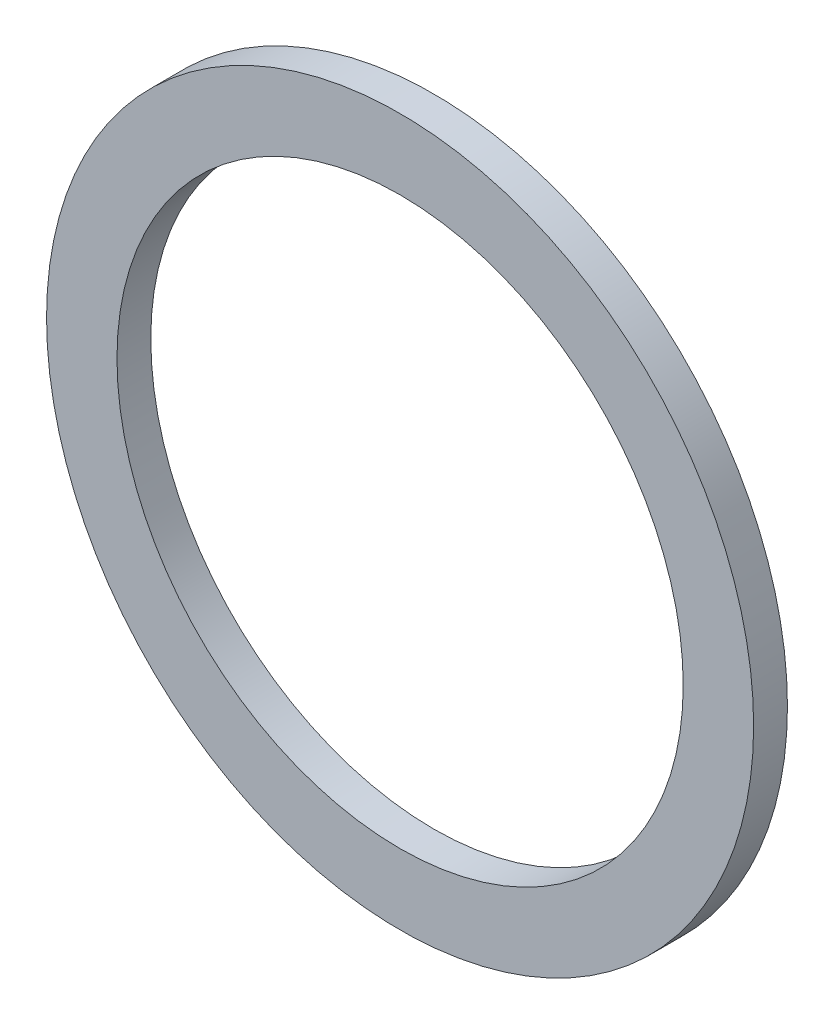
ISO-10303-21;
HEADER;
FILE_DESCRIPTION(('STEP AP214'),'2;1');
FILE_NAME('part.step','',(''),(''),'','','');
FILE_SCHEMA(('AUTOMOTIVE_DESIGN { 1 0 10303 214 1 1 1 1 }'));
ENDSEC;
DATA;
#1=APPLICATION_CONTEXT('core data for automotive mechanical design processes');
#2=APPLICATION_PROTOCOL_DEFINITION('international standard','automotive_design',2000,#1);
#3=PRODUCT_CONTEXT('',#1,'mechanical');
#4=PRODUCT('Part','Part','',(#3));
#5=PRODUCT_RELATED_PRODUCT_CATEGORY('part','',(#4));
#6=PRODUCT_DEFINITION_FORMATION('','',#4);
#7=PRODUCT_DEFINITION_CONTEXT('part definition',#1,'design');
#8=PRODUCT_DEFINITION('design','',#6,#7);
#9=PRODUCT_DEFINITION_SHAPE('','',#8);
#10=(LENGTH_UNIT() NAMED_UNIT(*) SI_UNIT(.MILLI.,.METRE.));
#11=(NAMED_UNIT(*) PLANE_ANGLE_UNIT() SI_UNIT($,.RADIAN.));
#12=(NAMED_UNIT(*) SI_UNIT($,.STERADIAN.) SOLID_ANGLE_UNIT());
#13=UNCERTAINTY_MEASURE_WITH_UNIT(LENGTH_MEASURE(1.E-05),#10,'distance_accuracy_value','');
#14=(GEOMETRIC_REPRESENTATION_CONTEXT(3) GLOBAL_UNCERTAINTY_ASSIGNED_CONTEXT((#13)) GLOBAL_UNIT_ASSIGNED_CONTEXT((#10,
#11,#12)) REPRESENTATION_CONTEXT('',''));
#15=CARTESIAN_POINT('',(0.,0.,0.));
#16=DIRECTION('',(0.,0.,1.));
#17=DIRECTION('',(1.,0.,0.));
#18=AXIS2_PLACEMENT_3D('',#15,#16,#17);
#19=CARTESIAN_POINT('',(0.,0.,3.048));
#20=DIRECTION('',(0.,0.,1.));
#21=DIRECTION('',(1.,0.,0.));
#22=AXIS2_PLACEMENT_3D('',#19,#20,#21);
#23=PLANE('',#22);
#24=CARTESIAN_POINT('',(0.,0.,3.048));
#25=DIRECTION('',(0.,0.,1.));
#26=DIRECTION('',(1.,0.,0.));
#27=AXIS2_PLACEMENT_3D('',#24,#25,#26);
#28=CIRCLE('',#27,31.877);
#29=CARTESIAN_POINT('',(-31.877,0.,3.048));
#30=VERTEX_POINT('',#29);
#31=EDGE_CURVE('E11',#30,#30,#28,.T.);
#32=ORIENTED_EDGE('',*,*,#31,.T.);
#33=EDGE_LOOP('',(#32));
#34=FACE_BOUND('',#33,.T.);
#35=CARTESIAN_POINT('',(0.,0.,3.048));
#36=DIRECTION('',(0.,0.,1.));
#37=DIRECTION('',(1.,0.,0.));
#38=AXIS2_PLACEMENT_3D('',#35,#36,#37);
#39=CIRCLE('',#38,25.527);
#40=CARTESIAN_POINT('',(-25.527,0.,3.048));
#41=VERTEX_POINT('',#40);
#42=EDGE_CURVE('E54',#41,#41,#39,.T.);
#43=ORIENTED_EDGE('',*,*,#42,.F.);
#44=EDGE_LOOP('',(#43));
#45=FACE_BOUND('',#44,.T.);
#46=ADVANCED_FACE('F43',(#34,#45),#23,.T.);
#47=CARTESIAN_POINT('',(0.,0.,0.));
#48=DIRECTION('',(0.,0.,1.));
#49=DIRECTION('',(1.,0.,0.));
#50=AXIS2_PLACEMENT_3D('',#47,#48,#49);
#51=PLANE('',#50);
#52=CARTESIAN_POINT('',(0.,0.,0.));
#53=DIRECTION('',(0.,0.,1.));
#54=DIRECTION('',(1.,0.,0.));
#55=AXIS2_PLACEMENT_3D('',#52,#53,#54);
#56=CIRCLE('',#55,31.877);
#57=CARTESIAN_POINT('',(-31.877,0.,0.));
#58=VERTEX_POINT('',#57);
#59=EDGE_CURVE('E47',#58,#58,#56,.T.);
#60=ORIENTED_EDGE('',*,*,#59,.F.);
#61=EDGE_LOOP('',(#60));
#62=FACE_BOUND('',#61,.T.);
#63=CARTESIAN_POINT('',(0.,0.,0.));
#64=DIRECTION('',(0.,0.,1.));
#65=DIRECTION('',(1.,0.,0.));
#66=AXIS2_PLACEMENT_3D('',#63,#64,#65);
#67=CIRCLE('',#66,25.527);
#68=CARTESIAN_POINT('',(-25.527,0.,0.));
#69=VERTEX_POINT('',#68);
#70=EDGE_CURVE('E56',#69,#69,#67,.T.);
#71=ORIENTED_EDGE('',*,*,#70,.T.);
#72=EDGE_LOOP('',(#71));
#73=FACE_BOUND('',#72,.T.);
#74=ADVANCED_FACE('F66',(#62,#73),#51,.F.);
#75=CARTESIAN_POINT('',(0.,0.,3.048));
#76=DIRECTION('',(0.,0.,-1.));
#77=DIRECTION('',(-1.,0.,0.));
#78=AXIS2_PLACEMENT_3D('',#75,#76,#77);
#79=CYLINDRICAL_SURFACE('',#78,31.877);
#80=CARTESIAN_POINT('',(-31.877,0.,3.048));
#81=CARTESIAN_POINT('',(-31.877,0.,3.01625));
#82=CARTESIAN_POINT('',(-31.877,0.,2.9845));
#83=CARTESIAN_POINT('',(-31.877,0.,2.921));
#84=CARTESIAN_POINT('',(-31.877,0.,2.88925));
#85=CARTESIAN_POINT('',(-31.877,0.,2.82575));
#86=CARTESIAN_POINT('',(-31.877,0.,2.794));
#87=CARTESIAN_POINT('',(-31.877,0.,2.7305));
#88=CARTESIAN_POINT('',(-31.877,0.,2.69875));
#89=CARTESIAN_POINT('',(-31.877,0.,2.63525));
#90=CARTESIAN_POINT('',(-31.877,0.,2.6035));
#91=CARTESIAN_POINT('',(-31.877,0.,2.54));
#92=CARTESIAN_POINT('',(-31.877,0.,2.50825));
#93=CARTESIAN_POINT('',(-31.877,0.,2.44475));
#94=CARTESIAN_POINT('',(-31.877,0.,2.413));
#95=CARTESIAN_POINT('',(-31.877,0.,2.3495));
#96=CARTESIAN_POINT('',(-31.877,0.,2.31775));
#97=CARTESIAN_POINT('',(-31.877,0.,2.25425));
#98=CARTESIAN_POINT('',(-31.877,0.,2.2225));
#99=CARTESIAN_POINT('',(-31.877,0.,2.159));
#100=CARTESIAN_POINT('',(-31.877,0.,2.12725));
#101=CARTESIAN_POINT('',(-31.877,0.,2.06375));
#102=CARTESIAN_POINT('',(-31.877,0.,2.032));
#103=CARTESIAN_POINT('',(-31.877,0.,1.9685));
#104=CARTESIAN_POINT('',(-31.877,0.,1.93675));
#105=CARTESIAN_POINT('',(-31.877,0.,1.87325));
#106=CARTESIAN_POINT('',(-31.877,0.,1.8415));
#107=CARTESIAN_POINT('',(-31.877,0.,1.778));
#108=CARTESIAN_POINT('',(-31.877,0.,1.74625));
#109=CARTESIAN_POINT('',(-31.877,0.,1.68275));
#110=CARTESIAN_POINT('',(-31.877,0.,1.651));
#111=CARTESIAN_POINT('',(-31.877,0.,1.5875));
#112=CARTESIAN_POINT('',(-31.877,0.,1.55575));
#113=CARTESIAN_POINT('',(-31.877,0.,1.49225));
#114=CARTESIAN_POINT('',(-31.877,0.,1.4605));
#115=CARTESIAN_POINT('',(-31.877,0.,1.397));
#116=CARTESIAN_POINT('',(-31.877,0.,1.36525));
#117=CARTESIAN_POINT('',(-31.877,0.,1.30175));
#118=CARTESIAN_POINT('',(-31.877,0.,1.27));
#119=CARTESIAN_POINT('',(-31.877,0.,1.2065));
#120=CARTESIAN_POINT('',(-31.877,0.,1.17475));
#121=CARTESIAN_POINT('',(-31.877,0.,1.11125));
#122=CARTESIAN_POINT('',(-31.877,0.,1.0795));
#123=CARTESIAN_POINT('',(-31.877,0.,1.016));
#124=CARTESIAN_POINT('',(-31.877,0.,0.98425));
#125=CARTESIAN_POINT('',(-31.877,0.,0.92075));
#126=CARTESIAN_POINT('',(-31.877,0.,0.889));
#127=CARTESIAN_POINT('',(-31.877,0.,0.8255));
#128=CARTESIAN_POINT('',(-31.877,0.,0.79375));
#129=CARTESIAN_POINT('',(-31.877,0.,0.73025));
#130=CARTESIAN_POINT('',(-31.877,0.,0.6985));
#131=CARTESIAN_POINT('',(-31.877,0.,0.635));
#132=CARTESIAN_POINT('',(-31.877,0.,0.60325));
#133=CARTESIAN_POINT('',(-31.877,0.,0.53975));
#134=CARTESIAN_POINT('',(-31.877,0.,0.508));
#135=CARTESIAN_POINT('',(-31.877,0.,0.4445));
#136=CARTESIAN_POINT('',(-31.877,0.,0.41275));
#137=CARTESIAN_POINT('',(-31.877,0.,0.34925));
#138=CARTESIAN_POINT('',(-31.877,0.,0.3175));
#139=CARTESIAN_POINT('',(-31.877,0.,0.254));
#140=CARTESIAN_POINT('',(-31.877,0.,0.22225));
#141=CARTESIAN_POINT('',(-31.877,0.,0.15875));
#142=CARTESIAN_POINT('',(-31.877,0.,0.127));
#143=CARTESIAN_POINT('',(-31.877,0.,0.0634999999999999));
#144=CARTESIAN_POINT('',(-31.877,0.,0.03175));
#145=CARTESIAN_POINT('',(-31.877,0.,0.));
#146=B_SPLINE_CURVE_WITH_KNOTS('',3,(#80,#81,#82,#83,#84,#85,#86,#87,#88,#89,#90,#91,#92,#93,
#94,#95,#96,#97,#98,#99,#100,#101,#102,#103,#104,#105,#106,#107,#108,#109,#110,#111,#112,#113,
#114,#115,#116,#117,#118,#119,#120,#121,#122,#123,#124,#125,#126,#127,#128,#129,#130,#131,#132,
#133,#134,#135,#136,#137,#138,#139,#140,#141,#142,#143,#144,#145),.UNSPECIFIED.,.F.,.F.,(4,2,2,
2,2,2,2,2,2,2,2,2,2,2,2,2,2,2,2,2,2,2,2,2,2,2,2,2,2,2,2,2,4),(0.,0.0952499999999998,0.1905,
0.28575,0.381,0.47625,0.5715,0.66675,0.762,0.85725,0.9525,1.04775,1.143,1.23825,1.3335,1.42875,
1.524,1.61925,1.7145,1.80975,1.905,2.00025,2.0955,2.19075,2.286,2.38125,2.4765,2.57175,2.667,
2.76225,2.8575,2.95275,3.048),.UNSPECIFIED.);
#147=EDGE_CURVE('BSEAM45',#30,#58,#146,.T.);
#148=ORIENTED_EDGE('',*,*,#31,.F.);
#149=ORIENTED_EDGE('',*,*,#59,.T.);
#150=ORIENTED_EDGE('',*,*,#147,.T.);
#151=ORIENTED_EDGE('',*,*,#147,.F.);
#152=EDGE_LOOP('',(#148,#150,#149,#151));
#153=FACE_BOUND('',#152,.T.);
#154=ADVANCED_FACE('F45',(#153),#79,.T.);
#155=CARTESIAN_POINT('',(0.,0.,3.048));
#156=DIRECTION('',(0.,0.,-1.));
#157=DIRECTION('',(-1.,0.,0.));
#158=AXIS2_PLACEMENT_3D('',#155,#156,#157);
#159=CYLINDRICAL_SURFACE('',#158,25.527);
#160=CARTESIAN_POINT('',(-25.527,0.,3.048));
#161=CARTESIAN_POINT('',(-25.527,0.,3.01625));
#162=CARTESIAN_POINT('',(-25.527,0.,2.9845));
#163=CARTESIAN_POINT('',(-25.527,0.,2.921));
#164=CARTESIAN_POINT('',(-25.527,0.,2.88925));
#165=CARTESIAN_POINT('',(-25.527,0.,2.82575));
#166=CARTESIAN_POINT('',(-25.527,0.,2.794));
#167=CARTESIAN_POINT('',(-25.527,0.,2.7305));
#168=CARTESIAN_POINT('',(-25.527,0.,2.69875));
#169=CARTESIAN_POINT('',(-25.527,0.,2.63525));
#170=CARTESIAN_POINT('',(-25.527,0.,2.6035));
#171=CARTESIAN_POINT('',(-25.527,0.,2.54));
#172=CARTESIAN_POINT('',(-25.527,0.,2.50825));
#173=CARTESIAN_POINT('',(-25.527,0.,2.44475));
#174=CARTESIAN_POINT('',(-25.527,0.,2.413));
#175=CARTESIAN_POINT('',(-25.527,0.,2.3495));
#176=CARTESIAN_POINT('',(-25.527,0.,2.31775));
#177=CARTESIAN_POINT('',(-25.527,0.,2.25425));
#178=CARTESIAN_POINT('',(-25.527,0.,2.2225));
#179=CARTESIAN_POINT('',(-25.527,0.,2.159));
#180=CARTESIAN_POINT('',(-25.527,0.,2.12725));
#181=CARTESIAN_POINT('',(-25.527,0.,2.06375));
#182=CARTESIAN_POINT('',(-25.527,0.,2.032));
#183=CARTESIAN_POINT('',(-25.527,0.,1.9685));
#184=CARTESIAN_POINT('',(-25.527,0.,1.93675));
#185=CARTESIAN_POINT('',(-25.527,0.,1.87325));
#186=CARTESIAN_POINT('',(-25.527,0.,1.8415));
#187=CARTESIAN_POINT('',(-25.527,0.,1.778));
#188=CARTESIAN_POINT('',(-25.527,0.,1.74625));
#189=CARTESIAN_POINT('',(-25.527,0.,1.68275));
#190=CARTESIAN_POINT('',(-25.527,0.,1.651));
#191=CARTESIAN_POINT('',(-25.527,0.,1.5875));
#192=CARTESIAN_POINT('',(-25.527,0.,1.55575));
#193=CARTESIAN_POINT('',(-25.527,0.,1.49225));
#194=CARTESIAN_POINT('',(-25.527,0.,1.4605));
#195=CARTESIAN_POINT('',(-25.527,0.,1.397));
#196=CARTESIAN_POINT('',(-25.527,0.,1.36525));
#197=CARTESIAN_POINT('',(-25.527,0.,1.30175));
#198=CARTESIAN_POINT('',(-25.527,0.,1.27));
#199=CARTESIAN_POINT('',(-25.527,0.,1.2065));
#200=CARTESIAN_POINT('',(-25.527,0.,1.17475));
#201=CARTESIAN_POINT('',(-25.527,0.,1.11125));
#202=CARTESIAN_POINT('',(-25.527,0.,1.0795));
#203=CARTESIAN_POINT('',(-25.527,0.,1.016));
#204=CARTESIAN_POINT('',(-25.527,0.,0.98425));
#205=CARTESIAN_POINT('',(-25.527,0.,0.92075));
#206=CARTESIAN_POINT('',(-25.527,0.,0.889));
#207=CARTESIAN_POINT('',(-25.527,0.,0.8255));
#208=CARTESIAN_POINT('',(-25.527,0.,0.79375));
#209=CARTESIAN_POINT('',(-25.527,0.,0.73025));
#210=CARTESIAN_POINT('',(-25.527,0.,0.6985));
#211=CARTESIAN_POINT('',(-25.527,0.,0.635));
#212=CARTESIAN_POINT('',(-25.527,0.,0.60325));
#213=CARTESIAN_POINT('',(-25.527,0.,0.53975));
#214=CARTESIAN_POINT('',(-25.527,0.,0.508));
#215=CARTESIAN_POINT('',(-25.527,0.,0.4445));
#216=CARTESIAN_POINT('',(-25.527,0.,0.41275));
#217=CARTESIAN_POINT('',(-25.527,0.,0.34925));
#218=CARTESIAN_POINT('',(-25.527,0.,0.3175));
#219=CARTESIAN_POINT('',(-25.527,0.,0.254));
#220=CARTESIAN_POINT('',(-25.527,0.,0.22225));
#221=CARTESIAN_POINT('',(-25.527,0.,0.15875));
#222=CARTESIAN_POINT('',(-25.527,0.,0.127));
#223=CARTESIAN_POINT('',(-25.527,0.,0.0634999999999999));
#224=CARTESIAN_POINT('',(-25.527,0.,0.03175));
#225=CARTESIAN_POINT('',(-25.527,0.,0.));
#226=B_SPLINE_CURVE_WITH_KNOTS('',3,(#160,#161,#162,#163,#164,#165,#166,#167,#168,#169,#170,
#171,#172,#173,#174,#175,#176,#177,#178,#179,#180,#181,#182,#183,#184,#185,#186,#187,#188,#189,
#190,#191,#192,#193,#194,#195,#196,#197,#198,#199,#200,#201,#202,#203,#204,#205,#206,#207,#208,
#209,#210,#211,#212,#213,#214,#215,#216,#217,#218,#219,#220,#221,#222,#223,#224,#225),
.UNSPECIFIED.,.F.,.F.,(4,2,2,2,2,2,2,2,2,2,2,2,2,2,2,2,2,2,2,2,2,2,2,2,2,2,2,2,2,2,2,2,4),(0.,
0.0952500000000003,0.1905,0.28575,0.381,0.47625,0.5715,0.66675,0.762,0.85725,0.9525,1.04775,
1.143,1.23825,1.3335,1.42875,1.524,1.61925,1.7145,1.80975,1.905,2.00025,2.0955,2.19075,2.286,
2.38125,2.4765,2.57175,2.667,2.76225,2.8575,2.95275,3.048),.UNSPECIFIED.);
#227=EDGE_CURVE('BSEAM62',#41,#69,#226,.T.);
#228=ORIENTED_EDGE('',*,*,#42,.T.);
#229=ORIENTED_EDGE('',*,*,#70,.F.);
#230=ORIENTED_EDGE('',*,*,#227,.T.);
#231=ORIENTED_EDGE('',*,*,#227,.F.);
#232=EDGE_LOOP('',(#228,#230,#229,#231));
#233=FACE_BOUND('',#232,.T.);
#234=ADVANCED_FACE('F62',(#233),#159,.F.);
#235=CLOSED_SHELL('',(#46,#74,#154,#234));
#236=MANIFOLD_SOLID_BREP('B2',#235);
#237=ADVANCED_BREP_SHAPE_REPRESENTATION('',(#18,#236),#14);
#238=SHAPE_DEFINITION_REPRESENTATION(#9,#237);
ENDSEC;
END-ISO-10303-21;
